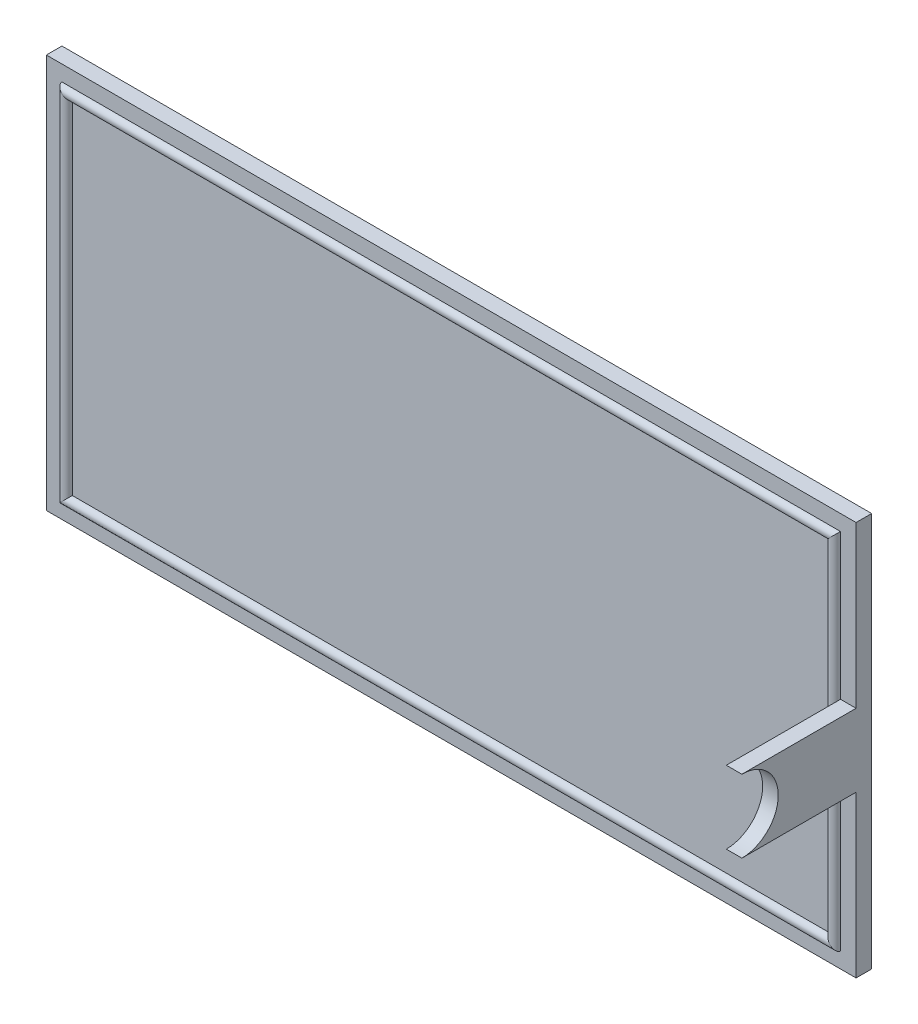
ISO-10303-21;
HEADER;
FILE_DESCRIPTION(('STEP AP214'),'2;1');
FILE_NAME('part.step','',(''),(''),'','','');
FILE_SCHEMA(('AUTOMOTIVE_DESIGN { 1 0 10303 214 1 1 1 1 }'));
ENDSEC;
DATA;
#1=APPLICATION_CONTEXT('core data for automotive mechanical design processes');
#2=APPLICATION_PROTOCOL_DEFINITION('international standard','automotive_design',2000,#1);
#3=PRODUCT_CONTEXT('',#1,'mechanical');
#4=PRODUCT('Part','Part','',(#3));
#5=PRODUCT_RELATED_PRODUCT_CATEGORY('part','',(#4));
#6=PRODUCT_DEFINITION_FORMATION('','',#4);
#7=PRODUCT_DEFINITION_CONTEXT('part definition',#1,'design');
#8=PRODUCT_DEFINITION('design','',#6,#7);
#9=PRODUCT_DEFINITION_SHAPE('','',#8);
#10=(LENGTH_UNIT() NAMED_UNIT(*) SI_UNIT(.MILLI.,.METRE.));
#11=(NAMED_UNIT(*) PLANE_ANGLE_UNIT() SI_UNIT($,.RADIAN.));
#12=(NAMED_UNIT(*) SI_UNIT($,.STERADIAN.) SOLID_ANGLE_UNIT());
#13=UNCERTAINTY_MEASURE_WITH_UNIT(LENGTH_MEASURE(1.E-05),#10,'distance_accuracy_value','');
#14=(GEOMETRIC_REPRESENTATION_CONTEXT(3) GLOBAL_UNCERTAINTY_ASSIGNED_CONTEXT((#13)) GLOBAL_UNIT_ASSIGNED_CONTEXT((#10,
#11,#12)) REPRESENTATION_CONTEXT('',''));
#15=CARTESIAN_POINT('',(0.,0.,0.));
#16=DIRECTION('',(0.,0.,1.));
#17=DIRECTION('',(1.,0.,0.));
#18=AXIS2_PLACEMENT_3D('',#15,#16,#17);
#19=CARTESIAN_POINT('',(0.,0.,1.5));
#20=DIRECTION('',(0.,0.,-1.));
#21=DIRECTION('',(-1.,0.,0.));
#22=AXIS2_PLACEMENT_3D('',#19,#20,#21);
#23=PLANE('',#22);
#24=DIRECTION('',(1.,0.,0.));
#25=VECTOR('',#24,1.);
#26=CARTESIAN_POINT('',(76.5,15.5,1.5));
#27=LINE('',#26,#25);
#28=CARTESIAN_POINT('',(76.5,15.5,1.5));
#29=VERTEX_POINT('',#28);
#30=CARTESIAN_POINT('',(78.,15.5,1.5));
#31=VERTEX_POINT('',#30);
#32=EDGE_CURVE('E156',#29,#31,#27,.T.);
#33=ORIENTED_EDGE('',*,*,#32,.F.);
#34=DIRECTION('',(0.,-1.,0.));
#35=VECTOR('',#34,1.);
#36=CARTESIAN_POINT('',(76.5,36.65,1.5));
#37=LINE('',#36,#35);
#38=CARTESIAN_POINT('',(76.5,1.5,1.5));
#39=VERTEX_POINT('',#38);
#40=EDGE_CURVE('E218',#29,#39,#37,.T.);
#41=ORIENTED_EDGE('',*,*,#40,.T.);
#42=DIRECTION('',(-1.,0.,0.));
#43=VECTOR('',#42,1.);
#44=CARTESIAN_POINT('',(76.65,1.5,1.5));
#45=LINE('',#44,#43);
#46=CARTESIAN_POINT('',(1.5,1.5,1.5));
#47=VERTEX_POINT('',#46);
#48=EDGE_CURVE('E221',#39,#47,#45,.T.);
#49=ORIENTED_EDGE('',*,*,#48,.T.);
#50=DIRECTION('',(0.,1.,0.));
#51=VECTOR('',#50,1.);
#52=CARTESIAN_POINT('',(1.5,1.35,1.5));
#53=LINE('',#52,#51);
#54=CARTESIAN_POINT('',(1.49999999999996,36.5,1.5));
#55=VERTEX_POINT('',#54);
#56=EDGE_CURVE('E12',#47,#55,#53,.T.);
#57=ORIENTED_EDGE('',*,*,#56,.T.);
#58=DIRECTION('',(1.,0.,0.));
#59=VECTOR('',#58,1.);
#60=CARTESIAN_POINT('',(1.34999999999996,36.5,1.5));
#61=LINE('',#60,#59);
#62=CARTESIAN_POINT('',(76.5,36.5,1.5));
#63=VERTEX_POINT('',#62);
#64=EDGE_CURVE('E53',#55,#63,#61,.T.);
#65=ORIENTED_EDGE('',*,*,#64,.T.);
#66=CARTESIAN_POINT('',(76.5,22.5,1.5));
#67=VERTEX_POINT('',#66);
#68=EDGE_CURVE('E219',#63,#67,#37,.T.);
#69=ORIENTED_EDGE('',*,*,#68,.T.);
#70=DIRECTION('',(-1.,0.,0.));
#71=VECTOR('',#70,1.);
#72=CARTESIAN_POINT('',(76.5,22.5,1.5));
#73=LINE('',#72,#71);
#74=CARTESIAN_POINT('',(78.,22.5,1.5));
#75=VERTEX_POINT('',#74);
#76=EDGE_CURVE('E60',#75,#67,#73,.T.);
#77=ORIENTED_EDGE('',*,*,#76,.F.);
#78=DIRECTION('',(0.,1.,0.));
#79=VECTOR('',#78,1.);
#80=CARTESIAN_POINT('',(78.,0.,1.5));
#81=LINE('',#80,#79);
#82=CARTESIAN_POINT('',(78.,38.,1.5));
#83=VERTEX_POINT('',#82);
#84=EDGE_CURVE('E183',#75,#83,#81,.T.);
#85=ORIENTED_EDGE('',*,*,#84,.T.);
#86=DIRECTION('',(-1.,0.,0.));
#87=VECTOR('',#86,1.);
#88=CARTESIAN_POINT('',(0.,38.,1.5));
#89=LINE('',#88,#87);
#90=CARTESIAN_POINT('',(0.,38.,1.5));
#91=VERTEX_POINT('',#90);
#92=EDGE_CURVE('E185',#83,#91,#89,.T.);
#93=ORIENTED_EDGE('',*,*,#92,.T.);
#94=DIRECTION('',(0.,-1.,0.));
#95=VECTOR('',#94,1.);
#96=CARTESIAN_POINT('',(0.,0.,1.5));
#97=LINE('',#96,#95);
#98=CARTESIAN_POINT('',(0.,0.,1.5));
#99=VERTEX_POINT('',#98);
#100=EDGE_CURVE('E177',#91,#99,#97,.T.);
#101=ORIENTED_EDGE('',*,*,#100,.T.);
#102=DIRECTION('',(1.,0.,0.));
#103=VECTOR('',#102,1.);
#104=CARTESIAN_POINT('',(0.,0.,1.5));
#105=LINE('',#104,#103);
#106=CARTESIAN_POINT('',(78.,0.,1.5));
#107=VERTEX_POINT('',#106);
#108=EDGE_CURVE('E180',#99,#107,#105,.T.);
#109=ORIENTED_EDGE('',*,*,#108,.T.);
#110=EDGE_CURVE('E67',#107,#31,#81,.T.);
#111=ORIENTED_EDGE('',*,*,#110,.T.);
#112=EDGE_LOOP('',(#33,#41,#49,#57,#65,#69,#77,#85,#93,#101,#109,#111));
#113=FACE_BOUND('',#112,.T.);
#114=ADVANCED_FACE('F45',(#113),#23,.F.);
#115=CARTESIAN_POINT('',(0.,0.,1.5));
#116=DIRECTION('',(1.,0.,0.));
#117=DIRECTION('',(0.,1.,0.));
#118=AXIS2_PLACEMENT_3D('',#115,#116,#117);
#119=PLANE('',#118);
#120=DIRECTION('',(0.,-1.,0.));
#121=VECTOR('',#120,1.);
#122=CARTESIAN_POINT('',(0.,0.,0.));
#123=LINE('',#122,#121);
#124=CARTESIAN_POINT('',(0.,38.,0.));
#125=VERTEX_POINT('',#124);
#126=CARTESIAN_POINT('',(0.,0.,0.));
#127=VERTEX_POINT('',#126);
#128=EDGE_CURVE('E168',#125,#127,#123,.T.);
#129=ORIENTED_EDGE('',*,*,#128,.T.);
#130=DIRECTION('',(0.,0.,-1.));
#131=VECTOR('',#130,1.);
#132=CARTESIAN_POINT('',(0.,0.,1.5));
#133=LINE('',#132,#131);
#134=EDGE_CURVE('E203',#99,#127,#133,.T.);
#135=ORIENTED_EDGE('',*,*,#134,.F.);
#136=ORIENTED_EDGE('',*,*,#100,.F.);
#137=DIRECTION('',(0.,0.,-1.));
#138=VECTOR('',#137,1.);
#139=CARTESIAN_POINT('',(0.,38.,1.5));
#140=LINE('',#139,#138);
#141=EDGE_CURVE('E187',#91,#125,#140,.T.);
#142=ORIENTED_EDGE('',*,*,#141,.T.);
#143=EDGE_LOOP('',(#129,#135,#136,#142));
#144=FACE_BOUND('',#143,.T.);
#145=ADVANCED_FACE('F47',(#144),#119,.F.);
#146=CARTESIAN_POINT('',(0.,0.,1.5));
#147=DIRECTION('',(0.,1.,0.));
#148=DIRECTION('',(0.,0.,1.));
#149=AXIS2_PLACEMENT_3D('',#146,#147,#148);
#150=PLANE('',#149);
#151=DIRECTION('',(1.,0.,0.));
#152=VECTOR('',#151,1.);
#153=CARTESIAN_POINT('',(0.,0.,0.));
#154=LINE('',#153,#152);
#155=CARTESIAN_POINT('',(78.,0.,0.));
#156=VERTEX_POINT('',#155);
#157=EDGE_CURVE('E190',#127,#156,#154,.T.);
#158=ORIENTED_EDGE('',*,*,#157,.T.);
#159=DIRECTION('',(0.,0.,-1.));
#160=VECTOR('',#159,1.);
#161=CARTESIAN_POINT('',(78.,0.,1.5));
#162=LINE('',#161,#160);
#163=EDGE_CURVE('E200',#107,#156,#162,.T.);
#164=ORIENTED_EDGE('',*,*,#163,.F.);
#165=ORIENTED_EDGE('',*,*,#108,.F.);
#166=ORIENTED_EDGE('',*,*,#134,.T.);
#167=EDGE_LOOP('',(#158,#164,#165,#166));
#168=FACE_BOUND('',#167,.T.);
#169=ADVANCED_FACE('F265',(#168),#150,.F.);
#170=CARTESIAN_POINT('',(78.,0.,1.5));
#171=DIRECTION('',(-1.,0.,0.));
#172=DIRECTION('',(0.,-1.,0.));
#173=AXIS2_PLACEMENT_3D('',#170,#171,#172);
#174=PLANE('',#173);
#175=DIRECTION('',(0.,0.,-1.));
#176=VECTOR('',#175,1.);
#177=CARTESIAN_POINT('',(78.,22.5,12.5));
#178=LINE('',#177,#176);
#179=CARTESIAN_POINT('',(78.,22.5,12.5));
#180=VERTEX_POINT('',#179);
#181=EDGE_CURVE('E152',#180,#75,#178,.T.);
#182=ORIENTED_EDGE('',*,*,#181,.F.);
#183=CARTESIAN_POINT('',(78.,19.,12.5));
#184=DIRECTION('',(1.,0.,0.));
#185=DIRECTION('',(0.,1.,0.));
#186=AXIS2_PLACEMENT_3D('',#183,#184,#185);
#187=CIRCLE('',#186,3.5);
#188=CARTESIAN_POINT('',(78.,15.5,12.5));
#189=VERTEX_POINT('',#188);
#190=EDGE_CURVE('E137',#189,#180,#187,.T.);
#191=ORIENTED_EDGE('',*,*,#190,.F.);
#192=DIRECTION('',(0.,0.,-1.));
#193=VECTOR('',#192,1.);
#194=CARTESIAN_POINT('',(78.,15.5,12.5));
#195=LINE('',#194,#193);
#196=EDGE_CURVE('E150',#189,#31,#195,.T.);
#197=ORIENTED_EDGE('',*,*,#196,.T.);
#198=ORIENTED_EDGE('',*,*,#110,.F.);
#199=ORIENTED_EDGE('',*,*,#163,.T.);
#200=DIRECTION('',(0.,1.,0.));
#201=VECTOR('',#200,1.);
#202=CARTESIAN_POINT('',(78.,0.,0.));
#203=LINE('',#202,#201);
#204=CARTESIAN_POINT('',(78.,38.,0.));
#205=VERTEX_POINT('',#204);
#206=EDGE_CURVE('E192',#156,#205,#203,.T.);
#207=ORIENTED_EDGE('',*,*,#206,.T.);
#208=DIRECTION('',(0.,0.,-1.));
#209=VECTOR('',#208,1.);
#210=CARTESIAN_POINT('',(78.,38.,1.5));
#211=LINE('',#210,#209);
#212=EDGE_CURVE('E197',#83,#205,#211,.T.);
#213=ORIENTED_EDGE('',*,*,#212,.F.);
#214=ORIENTED_EDGE('',*,*,#84,.F.);
#215=EDGE_LOOP('',(#182,#191,#197,#198,#199,#207,#213,#214));
#216=FACE_BOUND('',#215,.T.);
#217=ADVANCED_FACE('F149',(#216),#174,.F.);
#218=CARTESIAN_POINT('',(0.,38.,1.5));
#219=DIRECTION('',(0.,-1.,0.));
#220=DIRECTION('',(0.,0.,-1.));
#221=AXIS2_PLACEMENT_3D('',#218,#219,#220);
#222=PLANE('',#221);
#223=DIRECTION('',(-1.,0.,0.));
#224=VECTOR('',#223,1.);
#225=CARTESIAN_POINT('',(0.,38.,0.));
#226=LINE('',#225,#224);
#227=EDGE_CURVE('E181',#205,#125,#226,.T.);
#228=ORIENTED_EDGE('',*,*,#227,.T.);
#229=ORIENTED_EDGE('',*,*,#141,.F.);
#230=ORIENTED_EDGE('',*,*,#92,.F.);
#231=ORIENTED_EDGE('',*,*,#212,.T.);
#232=EDGE_LOOP('',(#228,#229,#230,#231));
#233=FACE_BOUND('',#232,.T.);
#234=ADVANCED_FACE('F287',(#233),#222,.F.);
#235=CARTESIAN_POINT('',(0.,0.,0.));
#236=DIRECTION('',(0.,0.,-1.));
#237=DIRECTION('',(-1.,0.,0.));
#238=AXIS2_PLACEMENT_3D('',#235,#236,#237);
#239=PLANE('',#238);
#240=ORIENTED_EDGE('',*,*,#128,.F.);
#241=ORIENTED_EDGE('',*,*,#227,.F.);
#242=ORIENTED_EDGE('',*,*,#206,.F.);
#243=ORIENTED_EDGE('',*,*,#157,.F.);
#244=EDGE_LOOP('',(#240,#241,#242,#243));
#245=FACE_BOUND('',#244,.T.);
#246=ADVANCED_FACE('F283',(#245),#239,.T.);
#247=CARTESIAN_POINT('',(2.,1.35,1.5));
#248=DIRECTION('',(0.,1.,0.));
#249=DIRECTION('',(-1.,0.,0.));
#250=AXIS2_PLACEMENT_3D('',#247,#248,#249);
#251=CYLINDRICAL_SURFACE('',#250,0.5);
#252=ORIENTED_EDGE('',*,*,#56,.F.);
#253=CARTESIAN_POINT('',(2.,2.,1.5));
#254=DIRECTION('',(-0.707106781186548,0.707106781186547,0.));
#255=DIRECTION('',(-0.707106781186547,-0.707106781186548,0.));
#256=AXIS2_PLACEMENT_3D('',#253,#254,#255);
#257=ELLIPSE('',#256,0.707106781186548,0.5);
#258=CARTESIAN_POINT('',(2.5,2.5,1.5));
#259=VERTEX_POINT('',#258);
#260=EDGE_CURVE('E172',#259,#47,#257,.F.);
#261=ORIENTED_EDGE('',*,*,#260,.F.);
#262=DIRECTION('',(0.,1.,0.));
#263=VECTOR('',#262,1.);
#264=CARTESIAN_POINT('',(2.5,1.35,1.5));
#265=LINE('',#264,#263);
#266=CARTESIAN_POINT('',(2.49999999999996,35.5,1.5));
#267=VERTEX_POINT('',#266);
#268=EDGE_CURVE('E215',#267,#259,#265,.F.);
#269=ORIENTED_EDGE('',*,*,#268,.F.);
#270=CARTESIAN_POINT('',(1.99999999999996,36.,1.5));
#271=DIRECTION('',(0.707106781186547,0.707106781186548,0.));
#272=DIRECTION('',(0.707106781186548,-0.707106781186547,0.));
#273=AXIS2_PLACEMENT_3D('',#270,#271,#272);
#274=ELLIPSE('',#273,0.707106781186548,0.5);
#275=EDGE_CURVE('E159',#267,#55,#274,.F.);
#276=ORIENTED_EDGE('',*,*,#275,.T.);
#277=EDGE_LOOP('',(#252,#261,#269,#276));
#278=FACE_BOUND('',#277,.T.);
#279=ADVANCED_FACE('F229',(#278),#251,.T.);
#280=CARTESIAN_POINT('',(1.34999999999996,36.,1.5));
#281=DIRECTION('',(1.,0.,0.));
#282=DIRECTION('',(0.,0.,-1.));
#283=AXIS2_PLACEMENT_3D('',#280,#281,#282);
#284=CYLINDRICAL_SURFACE('',#283,0.5);
#285=ORIENTED_EDGE('',*,*,#64,.F.);
#286=ORIENTED_EDGE('',*,*,#275,.F.);
#287=DIRECTION('',(1.,0.,0.));
#288=VECTOR('',#287,1.);
#289=CARTESIAN_POINT('',(1.34999999999996,35.5,1.5));
#290=LINE('',#289,#288);
#291=CARTESIAN_POINT('',(75.5,35.5,1.5));
#292=VERTEX_POINT('',#291);
#293=EDGE_CURVE('E212',#292,#267,#290,.F.);
#294=ORIENTED_EDGE('',*,*,#293,.F.);
#295=CARTESIAN_POINT('',(76.,36.,1.5));
#296=DIRECTION('',(0.707106781186548,-0.707106781186547,0.));
#297=DIRECTION('',(-0.707106781186547,-0.707106781186548,0.));
#298=AXIS2_PLACEMENT_3D('',#295,#296,#297);
#299=ELLIPSE('',#298,0.707106781186548,0.5);
#300=EDGE_CURVE('E169',#292,#63,#299,.F.);
#301=ORIENTED_EDGE('',*,*,#300,.T.);
#302=EDGE_LOOP('',(#285,#286,#294,#301));
#303=FACE_BOUND('',#302,.T.);
#304=ADVANCED_FACE('F226',(#303),#284,.T.);
#305=CARTESIAN_POINT('',(76.65,2.,1.5));
#306=DIRECTION('',(-1.,0.,0.));
#307=DIRECTION('',(0.,0.,1.));
#308=AXIS2_PLACEMENT_3D('',#305,#306,#307);
#309=CYLINDRICAL_SURFACE('',#308,0.5);
#310=ORIENTED_EDGE('',*,*,#48,.F.);
#311=CARTESIAN_POINT('',(76.,2.,1.5));
#312=DIRECTION('',(-0.707106781186547,-0.707106781186548,0.));
#313=DIRECTION('',(0.707106781186548,-0.707106781186547,0.));
#314=AXIS2_PLACEMENT_3D('',#311,#312,#313);
#315=ELLIPSE('',#314,0.707106781186549,0.5);
#316=CARTESIAN_POINT('',(75.5,2.5,1.5));
#317=VERTEX_POINT('',#316);
#318=EDGE_CURVE('E165',#317,#39,#315,.F.);
#319=ORIENTED_EDGE('',*,*,#318,.F.);
#320=DIRECTION('',(-1.,0.,0.));
#321=VECTOR('',#320,1.);
#322=CARTESIAN_POINT('',(76.65,2.5,1.5));
#323=LINE('',#322,#321);
#324=EDGE_CURVE('E209',#259,#317,#323,.F.);
#325=ORIENTED_EDGE('',*,*,#324,.F.);
#326=ORIENTED_EDGE('',*,*,#260,.T.);
#327=EDGE_LOOP('',(#310,#319,#325,#326));
#328=FACE_BOUND('',#327,.T.);
#329=ADVANCED_FACE('F238',(#328),#309,.T.);
#330=CARTESIAN_POINT('',(76.,36.65,1.5));
#331=DIRECTION('',(0.,-1.,0.));
#332=DIRECTION('',(1.,0.,0.));
#333=AXIS2_PLACEMENT_3D('',#330,#331,#332);
#334=CYLINDRICAL_SURFACE('',#333,0.5);
#335=ORIENTED_EDGE('',*,*,#68,.F.);
#336=ORIENTED_EDGE('',*,*,#300,.F.);
#337=DIRECTION('',(0.,-1.,0.));
#338=VECTOR('',#337,1.);
#339=CARTESIAN_POINT('',(75.5,36.65,1.5));
#340=LINE('',#339,#338);
#341=EDGE_CURVE('E206',#317,#292,#340,.F.);
#342=ORIENTED_EDGE('',*,*,#341,.F.);
#343=ORIENTED_EDGE('',*,*,#318,.T.);
#344=ORIENTED_EDGE('',*,*,#40,.F.);
#345=DIRECTION('',(0.,-1.,0.));
#346=VECTOR('',#345,1.);
#347=CARTESIAN_POINT('',(76.5,22.5,1.5));
#348=LINE('',#347,#346);
#349=EDGE_CURVE('E240',#67,#29,#348,.T.);
#350=ORIENTED_EDGE('',*,*,#349,.F.);
#351=EDGE_LOOP('',(#335,#336,#342,#343,#344,#350));
#352=FACE_BOUND('',#351,.T.);
#353=ADVANCED_FACE('F235',(#352),#334,.T.);
#354=ORIENTED_EDGE('',*,*,#293,.T.);
#355=ORIENTED_EDGE('',*,*,#268,.T.);
#356=ORIENTED_EDGE('',*,*,#324,.T.);
#357=ORIENTED_EDGE('',*,*,#341,.T.);
#358=EDGE_LOOP('',(#354,#355,#356,#357));
#359=FACE_BOUND('',#358,.T.);
#360=ADVANCED_FACE('F232',(#359),#23,.F.);
#361=CARTESIAN_POINT('',(76.5,22.5,12.5));
#362=DIRECTION('',(1.,0.,0.));
#363=DIRECTION('',(0.,0.,-1.));
#364=AXIS2_PLACEMENT_3D('',#361,#362,#363);
#365=PLANE('',#364);
#366=DIRECTION('',(0.,0.,-1.));
#367=VECTOR('',#366,1.);
#368=CARTESIAN_POINT('',(76.5,15.5,12.5));
#369=LINE('',#368,#367);
#370=CARTESIAN_POINT('',(76.5,15.5,12.5));
#371=VERTEX_POINT('',#370);
#372=EDGE_CURVE('E157',#371,#29,#369,.T.);
#373=ORIENTED_EDGE('',*,*,#372,.F.);
#374=CARTESIAN_POINT('',(76.5,19.,12.5));
#375=DIRECTION('',(1.,0.,0.));
#376=DIRECTION('',(0.,0.,-1.));
#377=AXIS2_PLACEMENT_3D('',#374,#375,#376);
#378=CIRCLE('',#377,3.5);
#379=CARTESIAN_POINT('',(76.5,22.5,12.5));
#380=VERTEX_POINT('',#379);
#381=EDGE_CURVE('E140',#371,#380,#378,.T.);
#382=ORIENTED_EDGE('',*,*,#381,.T.);
#383=DIRECTION('',(0.,0.,-1.));
#384=VECTOR('',#383,1.);
#385=CARTESIAN_POINT('',(76.5,22.5,12.5));
#386=LINE('',#385,#384);
#387=EDGE_CURVE('E161',#380,#67,#386,.T.);
#388=ORIENTED_EDGE('',*,*,#387,.T.);
#389=ORIENTED_EDGE('',*,*,#349,.T.);
#390=EDGE_LOOP('',(#373,#382,#388,#389));
#391=FACE_BOUND('',#390,.T.);
#392=ADVANCED_FACE('F250',(#391),#365,.F.);
#393=CARTESIAN_POINT('',(76.5,15.5,12.5));
#394=DIRECTION('',(0.,1.,0.));
#395=DIRECTION('',(0.,0.,1.));
#396=AXIS2_PLACEMENT_3D('',#393,#394,#395);
#397=PLANE('',#396);
#398=ORIENTED_EDGE('',*,*,#32,.T.);
#399=ORIENTED_EDGE('',*,*,#196,.F.);
#400=DIRECTION('',(1.,0.,0.));
#401=VECTOR('',#400,1.);
#402=CARTESIAN_POINT('',(76.5,15.5,12.5));
#403=LINE('',#402,#401);
#404=EDGE_CURVE('E134',#371,#189,#403,.T.);
#405=ORIENTED_EDGE('',*,*,#404,.F.);
#406=ORIENTED_EDGE('',*,*,#372,.T.);
#407=EDGE_LOOP('',(#398,#399,#405,#406));
#408=FACE_BOUND('',#407,.T.);
#409=ADVANCED_FACE('F155',(#408),#397,.F.);
#410=CARTESIAN_POINT('',(76.5,22.5,12.5));
#411=DIRECTION('',(0.,-1.,0.));
#412=DIRECTION('',(0.,0.,-1.));
#413=AXIS2_PLACEMENT_3D('',#410,#411,#412);
#414=PLANE('',#413);
#415=ORIENTED_EDGE('',*,*,#76,.T.);
#416=ORIENTED_EDGE('',*,*,#387,.F.);
#417=DIRECTION('',(-1.,0.,0.));
#418=VECTOR('',#417,1.);
#419=CARTESIAN_POINT('',(76.5,22.5,12.5));
#420=LINE('',#419,#418);
#421=EDGE_CURVE('E145',#180,#380,#420,.T.);
#422=ORIENTED_EDGE('',*,*,#421,.F.);
#423=ORIENTED_EDGE('',*,*,#181,.T.);
#424=EDGE_LOOP('',(#415,#416,#422,#423));
#425=FACE_BOUND('',#424,.T.);
#426=ADVANCED_FACE('F251',(#425),#414,.F.);
#427=CARTESIAN_POINT('',(67.,19.,12.5));
#428=DIRECTION('',(1.,0.,0.));
#429=DIRECTION('',(0.,1.,0.));
#430=AXIS2_PLACEMENT_3D('',#427,#428,#429);
#431=CYLINDRICAL_SURFACE('',#430,3.5);
#432=ORIENTED_EDGE('',*,*,#404,.T.);
#433=ORIENTED_EDGE('',*,*,#190,.T.);
#434=ORIENTED_EDGE('',*,*,#421,.T.);
#435=ORIENTED_EDGE('',*,*,#381,.F.);
#436=EDGE_LOOP('',(#432,#433,#434,#435));
#437=FACE_BOUND('',#436,.T.);
#438=ADVANCED_FACE('F136',(#437),#431,.F.);
#439=CLOSED_SHELL('',(#114,#145,#169,#217,#234,#246,#279,#304,#329,#353,#360,#392,#409,#426,#438));
#440=MANIFOLD_SOLID_BREP('B2',#439);
#441=ADVANCED_BREP_SHAPE_REPRESENTATION('',(#18,#440),#14);
#442=SHAPE_DEFINITION_REPRESENTATION(#9,#441);
ENDSEC;
END-ISO-10303-21;
